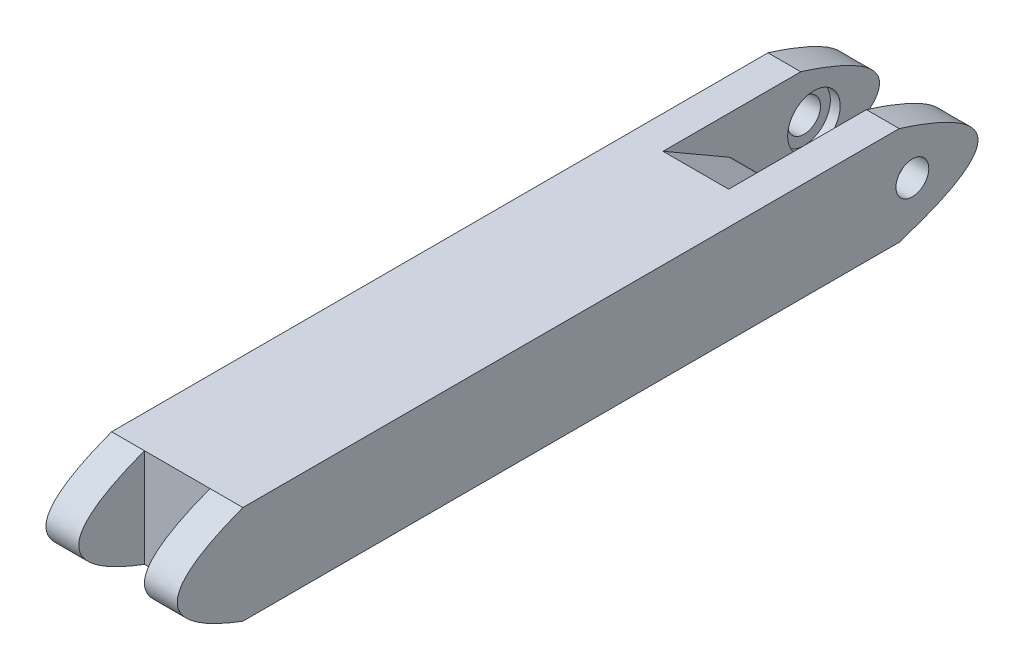
ISO-10303-21;
HEADER;
FILE_DESCRIPTION(('STEP AP214'),'2;1');
FILE_NAME('part.step','',(''),(''),'','','');
FILE_SCHEMA(('AUTOMOTIVE_DESIGN { 1 0 10303 214 1 1 1 1 }'));
ENDSEC;
DATA;
#1=APPLICATION_CONTEXT('core data for automotive mechanical design processes');
#2=APPLICATION_PROTOCOL_DEFINITION('international standard','automotive_design',2000,#1);
#3=PRODUCT_CONTEXT('',#1,'mechanical');
#4=PRODUCT('Part','Part','',(#3));
#5=PRODUCT_RELATED_PRODUCT_CATEGORY('part','',(#4));
#6=PRODUCT_DEFINITION_FORMATION('','',#4);
#7=PRODUCT_DEFINITION_CONTEXT('part definition',#1,'design');
#8=PRODUCT_DEFINITION('design','',#6,#7);
#9=PRODUCT_DEFINITION_SHAPE('','',#8);
#10=(LENGTH_UNIT() NAMED_UNIT(*) SI_UNIT(.MILLI.,.METRE.));
#11=(NAMED_UNIT(*) PLANE_ANGLE_UNIT() SI_UNIT($,.RADIAN.));
#12=(NAMED_UNIT(*) SI_UNIT($,.STERADIAN.) SOLID_ANGLE_UNIT());
#13=UNCERTAINTY_MEASURE_WITH_UNIT(LENGTH_MEASURE(1.E-05),#10,'distance_accuracy_value','');
#14=(GEOMETRIC_REPRESENTATION_CONTEXT(3) GLOBAL_UNCERTAINTY_ASSIGNED_CONTEXT((#13)) GLOBAL_UNIT_ASSIGNED_CONTEXT((#10,
#11,#12)) REPRESENTATION_CONTEXT('',''));
#15=CARTESIAN_POINT('',(0.,0.,0.));
#16=DIRECTION('',(0.,0.,1.));
#17=DIRECTION('',(1.,0.,0.));
#18=AXIS2_PLACEMENT_3D('',#15,#16,#17);
#19=CARTESIAN_POINT('',(20.,34.5460014069818,-60.4083375095747));
#20=DIRECTION('',(-1.,0.,0.));
#21=DIRECTION('',(0.,0.,1.));
#22=AXIS2_PLACEMENT_3D('',#19,#20,#21);
#23=CYLINDRICAL_SURFACE('',#22,4.00000000000001);
#24=CARTESIAN_POINT('',(15.,34.5460014069818,-60.4083375095747));
#25=DIRECTION('',(1.,0.,0.));
#26=DIRECTION('',(0.,0.,-1.));
#27=AXIS2_PLACEMENT_3D('',#24,#25,#26);
#28=CIRCLE('',#27,4.00000000000001);
#29=CARTESIAN_POINT('',(15.,34.5460014069818,-64.4083375095747));
#30=VERTEX_POINT('',#29);
#31=EDGE_CURVE('E161',#30,#30,#28,.T.);
#32=ORIENTED_EDGE('',*,*,#31,.F.);
#33=EDGE_LOOP('',(#32));
#34=FACE_BOUND('',#33,.T.);
#35=CARTESIAN_POINT('',(16.5,34.5460014069818,-60.4083375095747));
#36=DIRECTION('',(1.,0.,0.));
#37=DIRECTION('',(0.,0.,-1.));
#38=AXIS2_PLACEMENT_3D('',#35,#36,#37);
#39=CIRCLE('',#38,4.00000000000001);
#40=CARTESIAN_POINT('',(16.5,34.5460014069818,-64.4083375095747));
#41=VERTEX_POINT('',#40);
#42=EDGE_CURVE('E336',#41,#41,#39,.T.);
#43=ORIENTED_EDGE('',*,*,#42,.T.);
#44=EDGE_LOOP('',(#43));
#45=FACE_BOUND('',#44,.T.);
#46=ADVANCED_FACE('F37',(#34,#45),#23,.F.);
#47=CARTESIAN_POINT('',(5.,34.5460014069818,-60.4083375095747));
#48=DIRECTION('',(-1.,0.,0.));
#49=DIRECTION('',(0.,0.,1.));
#50=AXIS2_PLACEMENT_3D('',#47,#48,#49);
#51=CIRCLE('',#50,4.00000000000001);
#52=CARTESIAN_POINT('',(5.,34.5460014069818,-56.4083375095747));
#53=VERTEX_POINT('',#52);
#54=EDGE_CURVE('E135',#53,#53,#51,.T.);
#55=ORIENTED_EDGE('',*,*,#54,.F.);
#56=EDGE_LOOP('',(#55));
#57=FACE_BOUND('',#56,.T.);
#58=CARTESIAN_POINT('',(3.5,34.5460014069818,-60.4083375095747));
#59=DIRECTION('',(-1.,0.,0.));
#60=DIRECTION('',(0.,0.,1.));
#61=AXIS2_PLACEMENT_3D('',#58,#59,#60);
#62=CIRCLE('',#61,4.00000000000001);
#63=CARTESIAN_POINT('',(3.5,34.5460014069818,-56.4083375095747));
#64=VERTEX_POINT('',#63);
#65=EDGE_CURVE('E339',#64,#64,#62,.T.);
#66=ORIENTED_EDGE('',*,*,#65,.T.);
#67=EDGE_LOOP('',(#66));
#68=FACE_BOUND('',#67,.T.);
#69=ADVANCED_FACE('F306',(#57,#68),#23,.F.);
#70=CARTESIAN_POINT('',(20.,42.0460014069818,41.5916624904253));
#71=DIRECTION('',(0.,-1.,0.));
#72=DIRECTION('',(0.,0.,-1.));
#73=AXIS2_PLACEMENT_3D('',#70,#71,#72);
#74=PLANE('',#73);
#75=DIRECTION('',(0.,0.,1.));
#76=VECTOR('',#75,1.);
#77=CARTESIAN_POINT('',(15.,42.0460014069818,41.5916624904253));
#78=LINE('',#77,#76);
#79=CARTESIAN_POINT('',(15.,42.0460014069818,-58.4083375095747));
#80=VERTEX_POINT('',#79);
#81=CARTESIAN_POINT('',(15.,42.0460014069818,-37.417956452808));
#82=VERTEX_POINT('',#81);
#83=EDGE_CURVE('E164',#80,#82,#78,.T.);
#84=ORIENTED_EDGE('',*,*,#83,.T.);
#85=DIRECTION('',(-1.,0.,0.));
#86=VECTOR('',#85,1.);
#87=CARTESIAN_POINT('',(15.,42.0460014069818,-37.417956452808));
#88=LINE('',#87,#86);
#89=CARTESIAN_POINT('',(5.,42.0460014069818,-37.417956452808));
#90=VERTEX_POINT('',#89);
#91=EDGE_CURVE('E151',#82,#90,#88,.T.);
#92=ORIENTED_EDGE('',*,*,#91,.T.);
#93=DIRECTION('',(0.,0.,-1.));
#94=VECTOR('',#93,1.);
#95=CARTESIAN_POINT('',(5.00000000000002,42.0460014069818,41.5916624904253));
#96=LINE('',#95,#94);
#97=CARTESIAN_POINT('',(5.,42.0460014069818,-58.4083375095747));
#98=VERTEX_POINT('',#97);
#99=EDGE_CURVE('E173',#90,#98,#96,.T.);
#100=ORIENTED_EDGE('',*,*,#99,.T.);
#101=DIRECTION('',(-1.,0.,0.));
#102=VECTOR('',#101,1.);
#103=CARTESIAN_POINT('',(20.,42.0460014069818,-58.4083375095747));
#104=LINE('',#103,#102);
#105=CARTESIAN_POINT('',(0.,42.0460014069818,-58.4083375095747));
#106=VERTEX_POINT('',#105);
#107=EDGE_CURVE('E248',#98,#106,#104,.T.);
#108=ORIENTED_EDGE('',*,*,#107,.T.);
#109=DIRECTION('',(0.,0.,1.));
#110=VECTOR('',#109,1.);
#111=CARTESIAN_POINT('',(0.,42.0460014069818,41.5916624904253));
#112=LINE('',#111,#110);
#113=CARTESIAN_POINT('',(0.,42.0460014069818,41.5916624904253));
#114=VERTEX_POINT('',#113);
#115=EDGE_CURVE('E193',#106,#114,#112,.T.);
#116=ORIENTED_EDGE('',*,*,#115,.T.);
#117=DIRECTION('',(-1.,0.,0.));
#118=VECTOR('',#117,1.);
#119=CARTESIAN_POINT('',(20.,42.0460014069818,41.5916624904253));
#120=LINE('',#119,#118);
#121=CARTESIAN_POINT('',(5.,42.0460014069818,41.5916624904253));
#122=VERTEX_POINT('',#121);
#123=EDGE_CURVE('E224',#122,#114,#120,.T.);
#124=ORIENTED_EDGE('',*,*,#123,.F.);
#125=CARTESIAN_POINT('',(15.,42.0460014069818,41.5916624904253));
#126=VERTEX_POINT('',#125);
#127=EDGE_CURVE('E249',#126,#122,#120,.T.);
#128=ORIENTED_EDGE('',*,*,#127,.F.);
#129=CARTESIAN_POINT('',(20.,42.0460014069818,41.5916624904253));
#130=VERTEX_POINT('',#129);
#131=EDGE_CURVE('E245',#130,#126,#120,.T.);
#132=ORIENTED_EDGE('',*,*,#131,.F.);
#133=DIRECTION('',(0.,0.,1.));
#134=VECTOR('',#133,1.);
#135=CARTESIAN_POINT('',(20.,42.0460014069818,41.5916624904253));
#136=LINE('',#135,#134);
#137=CARTESIAN_POINT('',(20.,42.0460014069818,-58.4083375095747));
#138=VERTEX_POINT('',#137);
#139=EDGE_CURVE('E219',#138,#130,#136,.T.);
#140=ORIENTED_EDGE('',*,*,#139,.F.);
#141=EDGE_CURVE('E250',#138,#80,#104,.T.);
#142=ORIENTED_EDGE('',*,*,#141,.T.);
#143=EDGE_LOOP('',(#84,#92,#100,#108,#116,#124,#128,#132,#140,#142));
#144=FACE_BOUND('',#143,.T.);
#145=ADVANCED_FACE('F212',(#144),#74,.F.);
#146=CARTESIAN_POINT('',(20.,42.0460014069818,41.5916624904253));
#147=CARTESIAN_POINT('',(20.,34.5460014069818,61.5916624904253));
#148=CARTESIAN_POINT('',(20.,27.0460014069818,41.5916624904253));
#149=B_SPLINE_CURVE_WITH_KNOTS('',2,(#146,#147,#148),.UNSPECIFIED.,.F.,.F.,(3,3),(0.,1.),.UNSPECIFIED.);
#150=DIRECTION('',(-1.,0.,0.));
#151=VECTOR('',#150,1.);
#152=SURFACE_OF_LINEAR_EXTRUSION('',#149,#151);
#153=DIRECTION('',(-1.,0.,0.));
#154=VECTOR('',#153,1.);
#155=CARTESIAN_POINT('',(20.,27.0460014069818,41.5916624904253));
#156=LINE('',#155,#154);
#157=CARTESIAN_POINT('',(5.,27.0460014069818,41.5916624904253));
#158=VERTEX_POINT('',#157);
#159=CARTESIAN_POINT('',(0.,27.0460014069818,41.5916624904253));
#160=VERTEX_POINT('',#159);
#161=EDGE_CURVE('E256',#158,#160,#156,.T.);
#162=ORIENTED_EDGE('',*,*,#161,.F.);
#163=CARTESIAN_POINT('',(5.,42.0460014069818,41.5916624904253));
#164=CARTESIAN_POINT('',(5.,34.5460014069818,61.5916624904253));
#165=CARTESIAN_POINT('',(5.,27.0460014069818,41.5916624904253));
#166=B_SPLINE_CURVE_WITH_KNOTS('',2,(#163,#164,#165),.UNSPECIFIED.,.F.,.F.,(3,3),(0.,1.),.UNSPECIFIED.);
#167=EDGE_CURVE('E269',#158,#122,#166,.F.);
#168=ORIENTED_EDGE('',*,*,#167,.T.);
#169=ORIENTED_EDGE('',*,*,#123,.T.);
#170=CARTESIAN_POINT('',(0.,42.0460014069818,41.5916624904253));
#171=CARTESIAN_POINT('',(0.,34.5460014069818,61.5916624904253));
#172=CARTESIAN_POINT('',(0.,27.0460014069818,41.5916624904253));
#173=B_SPLINE_CURVE_WITH_KNOTS('',2,(#170,#171,#172),.UNSPECIFIED.,.F.,.F.,(3,3),(0.,1.),.UNSPECIFIED.);
#174=EDGE_CURVE('E185',#114,#160,#173,.T.);
#175=ORIENTED_EDGE('',*,*,#174,.T.);
#176=EDGE_LOOP('',(#162,#168,#169,#175));
#177=FACE_BOUND('',#176,.T.);
#178=ADVANCED_FACE('F203',(#177),#152,.F.);
#179=CARTESIAN_POINT('',(20.,27.0460014069818,-58.4083375095747));
#180=CARTESIAN_POINT('',(20.,34.5460014069818,-82.4083375095747));
#181=CARTESIAN_POINT('',(20.,42.0460014069818,-58.4083375095747));
#182=B_SPLINE_CURVE_WITH_KNOTS('',2,(#179,#180,#181),.UNSPECIFIED.,.F.,.F.,(3,3),(0.,1.),.UNSPECIFIED.);
#183=DIRECTION('',(-1.,0.,0.));
#184=VECTOR('',#183,1.);
#185=SURFACE_OF_LINEAR_EXTRUSION('',#182,#184);
#186=ORIENTED_EDGE('',*,*,#107,.F.);
#187=CARTESIAN_POINT('',(5.,27.0460014069818,-58.4083375095747));
#188=CARTESIAN_POINT('',(5.,34.5460014069818,-82.4083375095747));
#189=CARTESIAN_POINT('',(5.,42.0460014069818,-58.4083375095747));
#190=B_SPLINE_CURVE_WITH_KNOTS('',2,(#187,#188,#189),.UNSPECIFIED.,.F.,.F.,(3,3),(0.,1.),.UNSPECIFIED.);
#191=CARTESIAN_POINT('',(5.,27.0460014069818,-58.4083375095747));
#192=VERTEX_POINT('',#191);
#193=EDGE_CURVE('E176',#98,#192,#190,.F.);
#194=ORIENTED_EDGE('',*,*,#193,.T.);
#195=DIRECTION('',(-1.,0.,0.));
#196=VECTOR('',#195,1.);
#197=CARTESIAN_POINT('',(20.,27.0460014069818,-58.4083375095747));
#198=LINE('',#197,#196);
#199=CARTESIAN_POINT('',(0.,27.0460014069818,-58.4083375095747));
#200=VERTEX_POINT('',#199);
#201=EDGE_CURVE('E253',#192,#200,#198,.T.);
#202=ORIENTED_EDGE('',*,*,#201,.T.);
#203=CARTESIAN_POINT('',(0.,27.0460014069818,-58.4083375095747));
#204=CARTESIAN_POINT('',(0.,34.5460014069818,-82.4083375095747));
#205=CARTESIAN_POINT('',(0.,42.0460014069818,-58.4083375095747));
#206=B_SPLINE_CURVE_WITH_KNOTS('',2,(#203,#204,#205),.UNSPECIFIED.,.F.,.F.,(3,3),(0.,1.),.UNSPECIFIED.);
#207=EDGE_CURVE('E235',#200,#106,#206,.T.);
#208=ORIENTED_EDGE('',*,*,#207,.T.);
#209=EDGE_LOOP('',(#186,#194,#202,#208));
#210=FACE_BOUND('',#209,.T.);
#211=ADVANCED_FACE('F211',(#210),#185,.F.);
#212=CARTESIAN_POINT('',(20.,34.5460014069818,51.5916624904253));
#213=DIRECTION('',(-1.,0.,0.));
#214=DIRECTION('',(0.,0.,1.));
#215=AXIS2_PLACEMENT_3D('',#212,#213,#214);
#216=PLANE('',#215);
#217=CARTESIAN_POINT('',(20.,27.0460014069818,41.5916624904253));
#218=VERTEX_POINT('',#217);
#219=EDGE_CURVE('E186',#130,#218,#149,.T.);
#220=ORIENTED_EDGE('',*,*,#219,.T.);
#221=DIRECTION('',(0.,0.,-1.));
#222=VECTOR('',#221,1.);
#223=CARTESIAN_POINT('',(20.,27.0460014069818,41.5916624904253));
#224=LINE('',#223,#222);
#225=CARTESIAN_POINT('',(20.,27.0460014069818,-58.4083375095747));
#226=VERTEX_POINT('',#225);
#227=EDGE_CURVE('E192',#218,#226,#224,.T.);
#228=ORIENTED_EDGE('',*,*,#227,.T.);
#229=EDGE_CURVE('E214',#226,#138,#182,.T.);
#230=ORIENTED_EDGE('',*,*,#229,.T.);
#231=ORIENTED_EDGE('',*,*,#139,.T.);
#232=EDGE_LOOP('',(#220,#228,#230,#231));
#233=FACE_BOUND('',#232,.T.);
#234=CARTESIAN_POINT('',(20.,34.5460014069818,-60.4083375095747));
#235=DIRECTION('',(1.,0.,0.));
#236=DIRECTION('',(0.,0.,-1.));
#237=AXIS2_PLACEMENT_3D('',#234,#235,#236);
#238=CIRCLE('',#237,2.50000000000002);
#239=CARTESIAN_POINT('',(20.,34.5460014069818,-62.9083375095747));
#240=VERTEX_POINT('',#239);
#241=EDGE_CURVE('E541',#240,#240,#238,.T.);
#242=ORIENTED_EDGE('',*,*,#241,.F.);
#243=EDGE_LOOP('',(#242));
#244=FACE_BOUND('',#243,.T.);
#245=ADVANCED_FACE('F320',(#233,#244),#216,.F.);
#246=CARTESIAN_POINT('',(0.,34.5460014069818,51.5916624904253));
#247=DIRECTION('',(-1.,0.,0.));
#248=DIRECTION('',(0.,0.,1.));
#249=AXIS2_PLACEMENT_3D('',#246,#247,#248);
#250=PLANE('',#249);
#251=ORIENTED_EDGE('',*,*,#174,.F.);
#252=ORIENTED_EDGE('',*,*,#115,.F.);
#253=ORIENTED_EDGE('',*,*,#207,.F.);
#254=DIRECTION('',(0.,0.,-1.));
#255=VECTOR('',#254,1.);
#256=CARTESIAN_POINT('',(0.,27.0460014069818,41.5916624904253));
#257=LINE('',#256,#255);
#258=EDGE_CURVE('E229',#160,#200,#257,.T.);
#259=ORIENTED_EDGE('',*,*,#258,.F.);
#260=EDGE_LOOP('',(#251,#252,#253,#259));
#261=FACE_BOUND('',#260,.T.);
#262=CARTESIAN_POINT('',(0.,34.5460014069818,-60.4083375095747));
#263=DIRECTION('',(-1.,0.,0.));
#264=DIRECTION('',(0.,0.,1.));
#265=AXIS2_PLACEMENT_3D('',#262,#263,#264);
#266=CIRCLE('',#265,2.5);
#267=CARTESIAN_POINT('',(0.,34.5460014069818,-57.9083375095747));
#268=VERTEX_POINT('',#267);
#269=EDGE_CURVE('E333',#268,#268,#266,.T.);
#270=ORIENTED_EDGE('',*,*,#269,.F.);
#271=EDGE_LOOP('',(#270));
#272=FACE_BOUND('',#271,.T.);
#273=ADVANCED_FACE('F201',(#261,#272),#250,.T.);
#274=ORIENTED_EDGE('',*,*,#131,.T.);
#275=CARTESIAN_POINT('',(15.,42.0460014069818,41.5916624904253));
#276=CARTESIAN_POINT('',(15.,34.5460014069818,61.5916624904253));
#277=CARTESIAN_POINT('',(15.,27.0460014069818,41.5916624904253));
#278=B_SPLINE_CURVE_WITH_KNOTS('',2,(#275,#276,#277),.UNSPECIFIED.,.F.,.F.,(3,3),(0.,1.),.UNSPECIFIED.);
#279=CARTESIAN_POINT('',(15.,27.0460014069818,41.5916624904253));
#280=VERTEX_POINT('',#279);
#281=EDGE_CURVE('E260',#126,#280,#278,.T.);
#282=ORIENTED_EDGE('',*,*,#281,.T.);
#283=EDGE_CURVE('E257',#218,#280,#156,.T.);
#284=ORIENTED_EDGE('',*,*,#283,.F.);
#285=ORIENTED_EDGE('',*,*,#219,.F.);
#286=EDGE_LOOP('',(#274,#282,#284,#285));
#287=FACE_BOUND('',#286,.T.);
#288=ADVANCED_FACE('F198',(#287),#152,.F.);
#289=CARTESIAN_POINT('',(20.,27.0460014069818,41.5916624904253));
#290=DIRECTION('',(0.,1.,0.));
#291=DIRECTION('',(0.,0.,1.));
#292=AXIS2_PLACEMENT_3D('',#289,#290,#291);
#293=PLANE('',#292);
#294=DIRECTION('',(-1.,0.,0.));
#295=VECTOR('',#294,1.);
#296=CARTESIAN_POINT('',(15.,27.0460014069818,-37.4179564528082));
#297=LINE('',#296,#295);
#298=CARTESIAN_POINT('',(15.,27.0460014069818,-37.4179564528082));
#299=VERTEX_POINT('',#298);
#300=CARTESIAN_POINT('',(5.,27.0460014069818,-37.4179564528082));
#301=VERTEX_POINT('',#300);
#302=EDGE_CURVE('E139',#299,#301,#297,.T.);
#303=ORIENTED_EDGE('',*,*,#302,.F.);
#304=DIRECTION('',(0.,0.,-1.));
#305=VECTOR('',#304,1.);
#306=CARTESIAN_POINT('',(15.,27.0460014069818,41.5916624904253));
#307=LINE('',#306,#305);
#308=CARTESIAN_POINT('',(15.,27.0460014069818,-58.4083375095747));
#309=VERTEX_POINT('',#308);
#310=EDGE_CURVE('E125',#299,#309,#307,.T.);
#311=ORIENTED_EDGE('',*,*,#310,.T.);
#312=EDGE_CURVE('E254',#226,#309,#198,.T.);
#313=ORIENTED_EDGE('',*,*,#312,.F.);
#314=ORIENTED_EDGE('',*,*,#227,.F.);
#315=ORIENTED_EDGE('',*,*,#283,.T.);
#316=DIRECTION('',(1.,0.,0.));
#317=VECTOR('',#316,1.);
#318=CARTESIAN_POINT('',(5.,27.0460014069818,41.5916624904253));
#319=LINE('',#318,#317);
#320=EDGE_CURVE('E155',#158,#280,#319,.T.);
#321=ORIENTED_EDGE('',*,*,#320,.F.);
#322=ORIENTED_EDGE('',*,*,#161,.T.);
#323=ORIENTED_EDGE('',*,*,#258,.T.);
#324=ORIENTED_EDGE('',*,*,#201,.F.);
#325=DIRECTION('',(0.,0.,1.));
#326=VECTOR('',#325,1.);
#327=CARTESIAN_POINT('',(5.00000000000002,27.0460014069818,41.5916624904253));
#328=LINE('',#327,#326);
#329=EDGE_CURVE('E144',#192,#301,#328,.T.);
#330=ORIENTED_EDGE('',*,*,#329,.T.);
#331=EDGE_LOOP('',(#303,#311,#313,#314,#315,#321,#322,#323,#324,#330));
#332=FACE_BOUND('',#331,.T.);
#333=ADVANCED_FACE('F142',(#332),#293,.F.);
#334=ORIENTED_EDGE('',*,*,#312,.T.);
#335=CARTESIAN_POINT('',(15.,27.0460014069818,-58.4083375095747));
#336=CARTESIAN_POINT('',(15.,34.5460014069818,-82.4083375095747));
#337=CARTESIAN_POINT('',(15.,42.0460014069818,-58.4083375095747));
#338=B_SPLINE_CURVE_WITH_KNOTS('',2,(#335,#336,#337),.UNSPECIFIED.,.F.,.F.,(3,3),(0.,1.),.UNSPECIFIED.);
#339=EDGE_CURVE('E130',#309,#80,#338,.T.);
#340=ORIENTED_EDGE('',*,*,#339,.T.);
#341=ORIENTED_EDGE('',*,*,#141,.F.);
#342=ORIENTED_EDGE('',*,*,#229,.F.);
#343=EDGE_LOOP('',(#334,#340,#341,#342));
#344=FACE_BOUND('',#343,.T.);
#345=ADVANCED_FACE('F206',(#344),#185,.F.);
#346=CARTESIAN_POINT('',(5.,-35.,-70.4083375095747));
#347=DIRECTION('',(-1.,0.,0.));
#348=DIRECTION('',(0.,0.,1.));
#349=AXIS2_PLACEMENT_3D('',#346,#347,#348);
#350=PLANE('',#349);
#351=ORIENTED_EDGE('',*,*,#54,.T.);
#352=EDGE_LOOP('',(#351));
#353=FACE_BOUND('',#352,.T.);
#354=ORIENTED_EDGE('',*,*,#193,.F.);
#355=ORIENTED_EDGE('',*,*,#99,.F.);
#356=DIRECTION('',(0.,0.499999999999998,0.86602540378444));
#357=VECTOR('',#356,1.);
#358=CARTESIAN_POINT('',(5.,34.5460014069818,-50.4083375095747));
#359=LINE('',#358,#357);
#360=CARTESIAN_POINT('',(5.,36.2780522145506,-47.4083375095747));
#361=VERTEX_POINT('',#360);
#362=EDGE_CURVE('E145',#361,#90,#359,.T.);
#363=ORIENTED_EDGE('',*,*,#362,.F.);
#364=CARTESIAN_POINT('',(5.,34.5460014069818,-46.4083375095747));
#365=DIRECTION('',(-1.,0.,0.));
#366=DIRECTION('',(0.,0.,1.));
#367=AXIS2_PLACEMENT_3D('',#364,#365,#366);
#368=CIRCLE('',#367,2.);
#369=CARTESIAN_POINT('',(5.,32.8139505994129,-47.4083375095747));
#370=VERTEX_POINT('',#369);
#371=EDGE_CURVE('E45',#361,#370,#368,.T.);
#372=ORIENTED_EDGE('',*,*,#371,.T.);
#373=DIRECTION('',(0.,0.500000000000004,-0.866025403784436));
#374=VECTOR('',#373,1.);
#375=CARTESIAN_POINT('',(5.,34.5460014069818,-50.4083375095747));
#376=LINE('',#375,#374);
#377=EDGE_CURVE('E140',#301,#370,#376,.T.);
#378=ORIENTED_EDGE('',*,*,#377,.F.);
#379=ORIENTED_EDGE('',*,*,#329,.F.);
#380=EDGE_LOOP('',(#354,#355,#363,#372,#378,#379));
#381=FACE_BOUND('',#380,.T.);
#382=ADVANCED_FACE('F209',(#353,#381),#350,.F.);
#383=CARTESIAN_POINT('',(15.,-35.,-70.4083375095747));
#384=DIRECTION('',(1.,0.,0.));
#385=DIRECTION('',(0.,0.,-1.));
#386=AXIS2_PLACEMENT_3D('',#383,#384,#385);
#387=PLANE('',#386);
#388=ORIENTED_EDGE('',*,*,#31,.T.);
#389=EDGE_LOOP('',(#388));
#390=FACE_BOUND('',#389,.T.);
#391=ORIENTED_EDGE('',*,*,#310,.F.);
#392=DIRECTION('',(0.,0.500000000000004,-0.866025403784436));
#393=VECTOR('',#392,1.);
#394=CARTESIAN_POINT('',(15.,34.5460014069818,-50.4083375095747));
#395=LINE('',#394,#393);
#396=CARTESIAN_POINT('',(15.,32.8139505994129,-47.4083375095747));
#397=VERTEX_POINT('',#396);
#398=EDGE_CURVE('E127',#299,#397,#395,.T.);
#399=ORIENTED_EDGE('',*,*,#398,.T.);
#400=CARTESIAN_POINT('',(15.,34.5460014069818,-46.4083375095747));
#401=DIRECTION('',(1.,0.,0.));
#402=DIRECTION('',(0.,0.,-1.));
#403=AXIS2_PLACEMENT_3D('',#400,#401,#402);
#404=CIRCLE('',#403,2.);
#405=CARTESIAN_POINT('',(15.,36.2780522145506,-47.4083375095747));
#406=VERTEX_POINT('',#405);
#407=EDGE_CURVE('E11',#397,#406,#404,.T.);
#408=ORIENTED_EDGE('',*,*,#407,.T.);
#409=DIRECTION('',(0.,0.499999999999998,0.86602540378444));
#410=VECTOR('',#409,1.);
#411=CARTESIAN_POINT('',(15.,34.5460014069818,-50.4083375095747));
#412=LINE('',#411,#410);
#413=EDGE_CURVE('E147',#406,#82,#412,.T.);
#414=ORIENTED_EDGE('',*,*,#413,.T.);
#415=ORIENTED_EDGE('',*,*,#83,.F.);
#416=ORIENTED_EDGE('',*,*,#339,.F.);
#417=EDGE_LOOP('',(#391,#399,#408,#414,#415,#416));
#418=FACE_BOUND('',#417,.T.);
#419=ADVANCED_FACE('F126',(#390,#418),#387,.F.);
#420=CARTESIAN_POINT('',(5.,79.0460014069818,51.5916624904253));
#421=DIRECTION('',(-1.,0.,0.));
#422=DIRECTION('',(0.,0.,1.));
#423=AXIS2_PLACEMENT_3D('',#420,#421,#422);
#424=PLANE('',#423);
#425=DIRECTION('',(0.,-1.,0.));
#426=VECTOR('',#425,1.);
#427=CARTESIAN_POINT('',(5.,79.0460014069818,41.5916624904253));
#428=LINE('',#427,#426);
#429=EDGE_CURVE('E158',#122,#158,#428,.T.);
#430=ORIENTED_EDGE('',*,*,#429,.F.);
#431=ORIENTED_EDGE('',*,*,#167,.F.);
#432=EDGE_LOOP('',(#430,#431));
#433=FACE_BOUND('',#432,.T.);
#434=ADVANCED_FACE('F361',(#433),#424,.F.);
#435=CARTESIAN_POINT('',(15.,79.0460014069818,51.5916624904253));
#436=DIRECTION('',(1.,0.,0.));
#437=DIRECTION('',(0.,0.,-1.));
#438=AXIS2_PLACEMENT_3D('',#435,#436,#437);
#439=PLANE('',#438);
#440=DIRECTION('',(0.,-1.,0.));
#441=VECTOR('',#440,1.);
#442=CARTESIAN_POINT('',(15.,79.0460014069818,41.5916624904253));
#443=LINE('',#442,#441);
#444=EDGE_CURVE('E159',#126,#280,#443,.T.);
#445=ORIENTED_EDGE('',*,*,#444,.T.);
#446=ORIENTED_EDGE('',*,*,#281,.F.);
#447=EDGE_LOOP('',(#445,#446));
#448=FACE_BOUND('',#447,.T.);
#449=ADVANCED_FACE('F365',(#448),#439,.F.);
#450=CARTESIAN_POINT('',(5.,79.0460014069818,41.5916624904253));
#451=DIRECTION('',(0.,0.,-1.));
#452=DIRECTION('',(-1.,0.,0.));
#453=AXIS2_PLACEMENT_3D('',#450,#451,#452);
#454=PLANE('',#453);
#455=ORIENTED_EDGE('',*,*,#429,.T.);
#456=ORIENTED_EDGE('',*,*,#320,.T.);
#457=ORIENTED_EDGE('',*,*,#444,.F.);
#458=ORIENTED_EDGE('',*,*,#127,.T.);
#459=EDGE_LOOP('',(#455,#456,#457,#458));
#460=FACE_BOUND('',#459,.T.);
#461=ADVANCED_FACE('F359',(#460),#454,.F.);
#462=CARTESIAN_POINT('',(15.,34.5460014069818,-50.4083375095747));
#463=DIRECTION('',(0.,-0.86602540378444,0.499999999999998));
#464=DIRECTION('',(0.,-0.499999999999998,-0.86602540378444));
#465=AXIS2_PLACEMENT_3D('',#462,#463,#464);
#466=PLANE('',#465);
#467=ORIENTED_EDGE('',*,*,#413,.F.);
#468=DIRECTION('',(-1.,0.,0.));
#469=VECTOR('',#468,1.);
#470=CARTESIAN_POINT('',(15.,36.2780522145506,-47.4083375095747));
#471=LINE('',#470,#469);
#472=EDGE_CURVE('E277',#406,#361,#471,.T.);
#473=ORIENTED_EDGE('',*,*,#472,.T.);
#474=ORIENTED_EDGE('',*,*,#362,.T.);
#475=ORIENTED_EDGE('',*,*,#91,.F.);
#476=EDGE_LOOP('',(#467,#473,#474,#475));
#477=FACE_BOUND('',#476,.T.);
#478=ADVANCED_FACE('F286',(#477),#466,.F.);
#479=CARTESIAN_POINT('',(15.,34.5460014069818,-50.4083375095747));
#480=DIRECTION('',(0.,0.866025403784436,0.500000000000004));
#481=DIRECTION('',(0.,-0.500000000000004,0.866025403784436));
#482=AXIS2_PLACEMENT_3D('',#479,#480,#481);
#483=PLANE('',#482);
#484=ORIENTED_EDGE('',*,*,#377,.T.);
#485=DIRECTION('',(-1.,0.,0.));
#486=VECTOR('',#485,1.);
#487=CARTESIAN_POINT('',(15.,32.8139505994129,-47.4083375095747));
#488=LINE('',#487,#486);
#489=EDGE_CURVE('E52',#370,#397,#488,.F.);
#490=ORIENTED_EDGE('',*,*,#489,.T.);
#491=ORIENTED_EDGE('',*,*,#398,.F.);
#492=ORIENTED_EDGE('',*,*,#302,.T.);
#493=EDGE_LOOP('',(#484,#490,#491,#492));
#494=FACE_BOUND('',#493,.T.);
#495=ADVANCED_FACE('F138',(#494),#483,.F.);
#496=CARTESIAN_POINT('',(15.,34.5460014069818,-46.4083375095747));
#497=DIRECTION('',(-1.,0.,0.));
#498=DIRECTION('',(0.,0.,1.));
#499=AXIS2_PLACEMENT_3D('',#496,#497,#498);
#500=CYLINDRICAL_SURFACE('',#499,2.);
#501=ORIENTED_EDGE('',*,*,#407,.F.);
#502=ORIENTED_EDGE('',*,*,#489,.F.);
#503=ORIENTED_EDGE('',*,*,#371,.F.);
#504=ORIENTED_EDGE('',*,*,#472,.F.);
#505=EDGE_LOOP('',(#501,#502,#503,#504));
#506=FACE_BOUND('',#505,.T.);
#507=ADVANCED_FACE('F39',(#506),#500,.T.);
#508=CARTESIAN_POINT('',(3.5,34.5460014069818,-60.4083375095747));
#509=DIRECTION('',(-1.,0.,0.));
#510=DIRECTION('',(0.,0.,1.));
#511=AXIS2_PLACEMENT_3D('',#508,#509,#510);
#512=PLANE('',#511);
#513=CARTESIAN_POINT('',(3.5,34.5460014069818,-60.4083375095747));
#514=DIRECTION('',(-1.,0.,0.));
#515=DIRECTION('',(0.,0.,1.));
#516=AXIS2_PLACEMENT_3D('',#513,#514,#515);
#517=CIRCLE('',#516,2.5);
#518=CARTESIAN_POINT('',(3.5,34.5460014069818,-57.9083375095747));
#519=VERTEX_POINT('',#518);
#520=EDGE_CURVE('E335',#519,#519,#517,.T.);
#521=ORIENTED_EDGE('',*,*,#520,.T.);
#522=EDGE_LOOP('',(#521));
#523=FACE_BOUND('',#522,.T.);
#524=ORIENTED_EDGE('',*,*,#65,.F.);
#525=EDGE_LOOP('',(#524));
#526=FACE_BOUND('',#525,.T.);
#527=ADVANCED_FACE('F295',(#523,#526),#512,.F.);
#528=CARTESIAN_POINT('',(3.5,34.5460014069818,-60.4083375095747));
#529=DIRECTION('',(-1.,0.,0.));
#530=DIRECTION('',(0.,0.,1.));
#531=AXIS2_PLACEMENT_3D('',#528,#529,#530);
#532=CYLINDRICAL_SURFACE('',#531,2.5);
#533=ORIENTED_EDGE('',*,*,#520,.F.);
#534=EDGE_LOOP('',(#533));
#535=FACE_BOUND('',#534,.T.);
#536=ORIENTED_EDGE('',*,*,#269,.T.);
#537=EDGE_LOOP('',(#536));
#538=FACE_BOUND('',#537,.T.);
#539=ADVANCED_FACE('F301',(#535,#538),#532,.F.);
#540=CARTESIAN_POINT('',(16.5,34.5460014069818,-60.4083375095747));
#541=DIRECTION('',(1.,0.,0.));
#542=DIRECTION('',(0.,0.,-1.));
#543=AXIS2_PLACEMENT_3D('',#540,#541,#542);
#544=PLANE('',#543);
#545=CARTESIAN_POINT('',(16.5,34.5460014069818,-60.4083375095747));
#546=DIRECTION('',(1.,0.,0.));
#547=DIRECTION('',(0.,0.,-1.));
#548=AXIS2_PLACEMENT_3D('',#545,#546,#547);
#549=CIRCLE('',#548,2.50000000000002);
#550=CARTESIAN_POINT('',(16.5,34.5460014069818,-62.9083375095747));
#551=VERTEX_POINT('',#550);
#552=EDGE_CURVE('E342',#551,#551,#549,.T.);
#553=ORIENTED_EDGE('',*,*,#552,.T.);
#554=EDGE_LOOP('',(#553));
#555=FACE_BOUND('',#554,.T.);
#556=ORIENTED_EDGE('',*,*,#42,.F.);
#557=EDGE_LOOP('',(#556));
#558=FACE_BOUND('',#557,.T.);
#559=ADVANCED_FACE('F477',(#555,#558),#544,.F.);
#560=CARTESIAN_POINT('',(16.5,34.5460014069818,-60.4083375095747));
#561=DIRECTION('',(1.,0.,0.));
#562=DIRECTION('',(0.,0.,-1.));
#563=AXIS2_PLACEMENT_3D('',#560,#561,#562);
#564=CYLINDRICAL_SURFACE('',#563,2.50000000000002);
#565=ORIENTED_EDGE('',*,*,#552,.F.);
#566=EDGE_LOOP('',(#565));
#567=FACE_BOUND('',#566,.T.);
#568=ORIENTED_EDGE('',*,*,#241,.T.);
#569=EDGE_LOOP('',(#568));
#570=FACE_BOUND('',#569,.T.);
#571=ADVANCED_FACE('F482',(#567,#570),#564,.F.);
#572=CLOSED_SHELL('',(#46,#69,#145,#178,#211,#245,#273,#288,#333,#345,#382,#419,#434,#449,#461,
#478,#495,#507,#527,#539,#559,#571));
#573=MANIFOLD_SOLID_BREP('B2',#572);
#574=ADVANCED_BREP_SHAPE_REPRESENTATION('',(#18,#573),#14);
#575=SHAPE_DEFINITION_REPRESENTATION(#9,#574);
ENDSEC;
END-ISO-10303-21;
